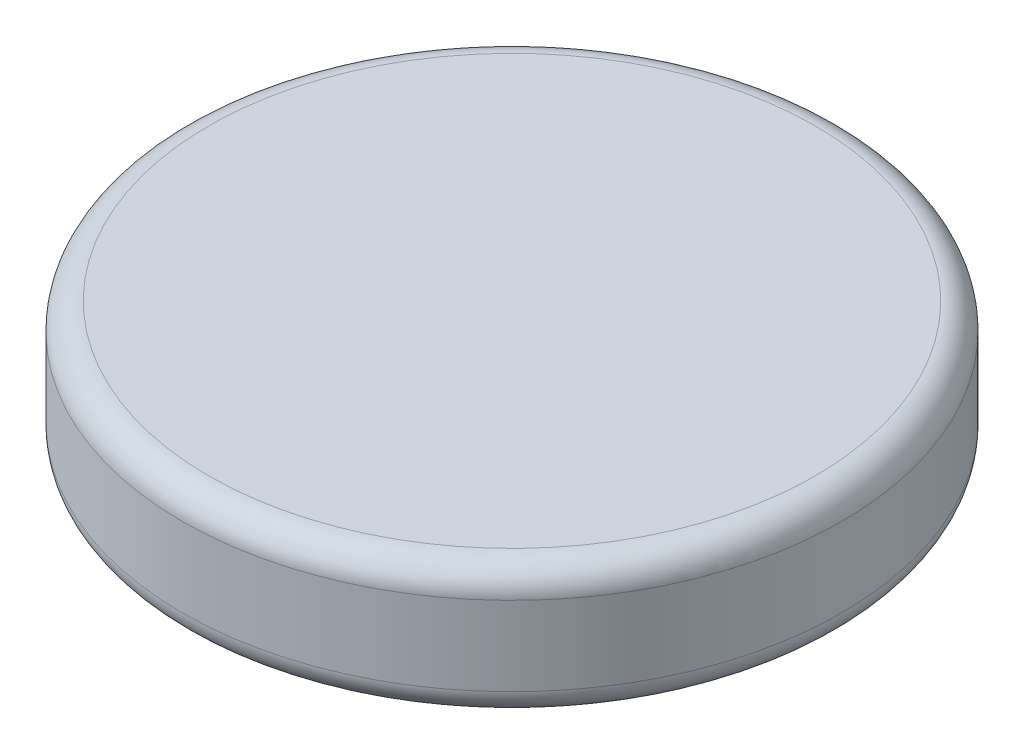
ISO-10303-21;
HEADER;
FILE_DESCRIPTION(('STEP AP214'),'2;1');
FILE_NAME('part.step','',(''),(''),'','','');
FILE_SCHEMA(('AUTOMOTIVE_DESIGN { 1 0 10303 214 1 1 1 1 }'));
ENDSEC;
DATA;
#1=APPLICATION_CONTEXT('core data for automotive mechanical design processes');
#2=APPLICATION_PROTOCOL_DEFINITION('international standard','automotive_design',2000,#1);
#3=PRODUCT_CONTEXT('',#1,'mechanical');
#4=PRODUCT('Part','Part','',(#3));
#5=PRODUCT_RELATED_PRODUCT_CATEGORY('part','',(#4));
#6=PRODUCT_DEFINITION_FORMATION('','',#4);
#7=PRODUCT_DEFINITION_CONTEXT('part definition',#1,'design');
#8=PRODUCT_DEFINITION('design','',#6,#7);
#9=PRODUCT_DEFINITION_SHAPE('','',#8);
#10=(LENGTH_UNIT() NAMED_UNIT(*) SI_UNIT(.MILLI.,.METRE.));
#11=(NAMED_UNIT(*) PLANE_ANGLE_UNIT() SI_UNIT($,.RADIAN.));
#12=(NAMED_UNIT(*) SI_UNIT($,.STERADIAN.) SOLID_ANGLE_UNIT());
#13=UNCERTAINTY_MEASURE_WITH_UNIT(LENGTH_MEASURE(1.E-05),#10,'distance_accuracy_value','');
#14=(GEOMETRIC_REPRESENTATION_CONTEXT(3) GLOBAL_UNCERTAINTY_ASSIGNED_CONTEXT((#13)) GLOBAL_UNIT_ASSIGNED_CONTEXT((#10,
#11,#12)) REPRESENTATION_CONTEXT('',''));
#15=CARTESIAN_POINT('',(0.,0.,0.));
#16=DIRECTION('',(0.,0.,1.));
#17=DIRECTION('',(1.,0.,0.));
#18=AXIS2_PLACEMENT_3D('',#15,#16,#17);
#19=CARTESIAN_POINT('',(0.,50.,0.));
#20=DIRECTION('',(0.,-1.,0.));
#21=DIRECTION('',(0.,0.,-1.));
#22=AXIS2_PLACEMENT_3D('',#19,#20,#21);
#23=CYLINDRICAL_SURFACE('',#22,125.);
#24=CARTESIAN_POINT('',(0.,10.,0.));
#25=DIRECTION('',(0.,1.,0.));
#26=DIRECTION('',(0.,0.,1.));
#27=AXIS2_PLACEMENT_3D('',#24,#25,#26);
#28=CIRCLE('',#27,125.);
#29=CARTESIAN_POINT('',(0.,10.,125.));
#30=VERTEX_POINT('',#29);
#31=EDGE_CURVE('E46',#30,#30,#28,.T.);
#32=ORIENTED_EDGE('',*,*,#31,.T.);
#33=EDGE_LOOP('',(#32));
#34=FACE_BOUND('',#33,.T.);
#35=CARTESIAN_POINT('',(0.,40.,0.));
#36=DIRECTION('',(0.,1.,0.));
#37=DIRECTION('',(0.,0.,1.));
#38=AXIS2_PLACEMENT_3D('',#35,#36,#37);
#39=CIRCLE('',#38,125.);
#40=CARTESIAN_POINT('',(0.,40.,125.));
#41=VERTEX_POINT('',#40);
#42=EDGE_CURVE('E50',#41,#41,#39,.F.);
#43=ORIENTED_EDGE('',*,*,#42,.T.);
#44=EDGE_LOOP('',(#43));
#45=FACE_BOUND('',#44,.T.);
#46=ADVANCED_FACE('F35',(#34,#45),#23,.T.);
#47=CARTESIAN_POINT('',(0.,50.,0.));
#48=DIRECTION('',(0.,1.,0.));
#49=DIRECTION('',(0.,0.,1.));
#50=AXIS2_PLACEMENT_3D('',#47,#48,#49);
#51=PLANE('',#50);
#52=CARTESIAN_POINT('',(0.,50.,0.));
#53=DIRECTION('',(0.,1.,0.));
#54=DIRECTION('',(0.,0.,1.));
#55=AXIS2_PLACEMENT_3D('',#52,#53,#54);
#56=CIRCLE('',#55,115.);
#57=CARTESIAN_POINT('',(0.,50.,115.));
#58=VERTEX_POINT('',#57);
#59=EDGE_CURVE('E10',#58,#58,#56,.T.);
#60=ORIENTED_EDGE('',*,*,#59,.T.);
#61=EDGE_LOOP('',(#60));
#62=FACE_BOUND('',#61,.T.);
#63=ADVANCED_FACE('F66',(#62),#51,.T.);
#64=CARTESIAN_POINT('',(0.,0.,0.));
#65=DIRECTION('',(0.,1.,0.));
#66=DIRECTION('',(0.,0.,1.));
#67=AXIS2_PLACEMENT_3D('',#64,#65,#66);
#68=PLANE('',#67);
#69=CARTESIAN_POINT('',(0.,0.,0.));
#70=DIRECTION('',(0.,1.,0.));
#71=DIRECTION('',(0.,0.,1.));
#72=AXIS2_PLACEMENT_3D('',#69,#70,#71);
#73=CIRCLE('',#72,115.);
#74=CARTESIAN_POINT('',(0.,0.,115.));
#75=VERTEX_POINT('',#74);
#76=EDGE_CURVE('E42',#75,#75,#73,.F.);
#77=ORIENTED_EDGE('',*,*,#76,.T.);
#78=EDGE_LOOP('',(#77));
#79=FACE_BOUND('',#78,.T.);
#80=ADVANCED_FACE('F63',(#79),#68,.F.);
#81=CARTESIAN_POINT('',(0.,10.,0.));
#82=DIRECTION('',(0.,1.,0.));
#83=DIRECTION('',(0.,0.,1.));
#84=AXIS2_PLACEMENT_3D('',#81,#82,#83);
#85=TOROIDAL_SURFACE('',#84,115.,10.);
#86=ORIENTED_EDGE('',*,*,#76,.F.);
#87=EDGE_LOOP('',(#86));
#88=FACE_BOUND('',#87,.T.);
#89=ORIENTED_EDGE('',*,*,#31,.F.);
#90=EDGE_LOOP('',(#89));
#91=FACE_BOUND('',#90,.T.);
#92=ADVANCED_FACE('F59',(#88,#91),#85,.T.);
#93=CARTESIAN_POINT('',(0.,40.,0.));
#94=DIRECTION('',(0.,1.,0.));
#95=DIRECTION('',(0.,0.,1.));
#96=AXIS2_PLACEMENT_3D('',#93,#94,#95);
#97=TOROIDAL_SURFACE('',#96,115.,10.);
#98=ORIENTED_EDGE('',*,*,#42,.F.);
#99=EDGE_LOOP('',(#98));
#100=FACE_BOUND('',#99,.T.);
#101=ORIENTED_EDGE('',*,*,#59,.F.);
#102=EDGE_LOOP('',(#101));
#103=FACE_BOUND('',#102,.T.);
#104=ADVANCED_FACE('F37',(#100,#103),#97,.T.);
#105=CLOSED_SHELL('',(#46,#63,#80,#92,#104));
#106=MANIFOLD_SOLID_BREP('B2',#105);
#107=ADVANCED_BREP_SHAPE_REPRESENTATION('',(#18,#106),#14);
#108=SHAPE_DEFINITION_REPRESENTATION(#9,#107);
ENDSEC;
END-ISO-10303-21;
